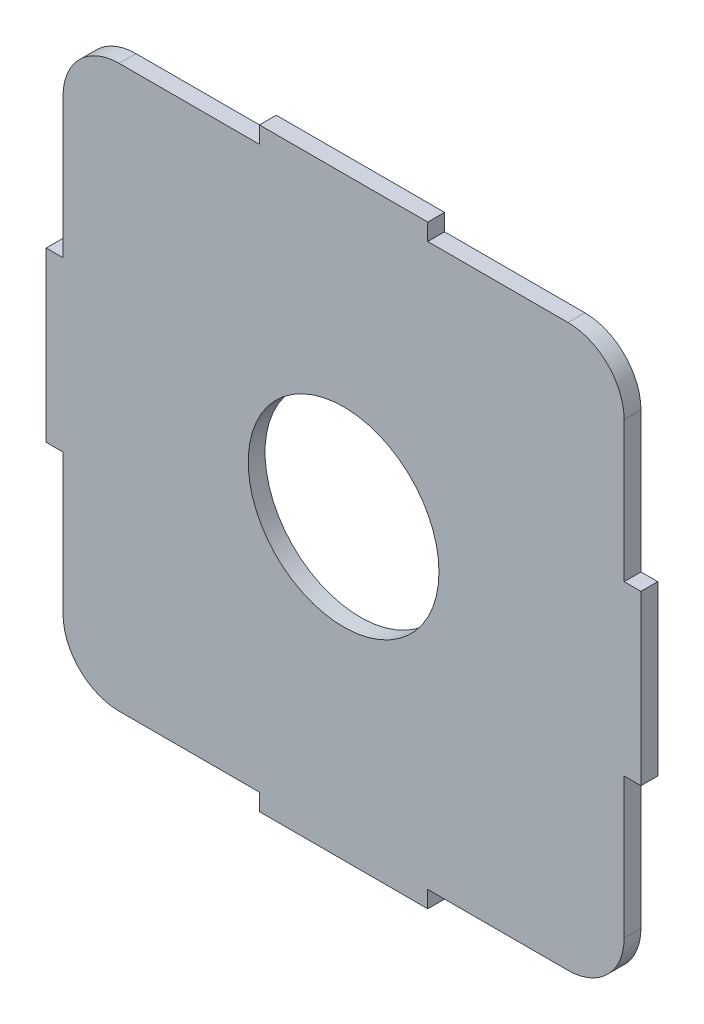
ISO-10303-21;
HEADER;
FILE_DESCRIPTION(('STEP AP214'),'2;1');
FILE_NAME('part.step','',(''),(''),'','','');
FILE_SCHEMA(('AUTOMOTIVE_DESIGN { 1 0 10303 214 1 1 1 1 }'));
ENDSEC;
DATA;
#1=APPLICATION_CONTEXT('core data for automotive mechanical design processes');
#2=APPLICATION_PROTOCOL_DEFINITION('international standard','automotive_design',2000,#1);
#3=PRODUCT_CONTEXT('',#1,'mechanical');
#4=PRODUCT('Part','Part','',(#3));
#5=PRODUCT_RELATED_PRODUCT_CATEGORY('part','',(#4));
#6=PRODUCT_DEFINITION_FORMATION('','',#4);
#7=PRODUCT_DEFINITION_CONTEXT('part definition',#1,'design');
#8=PRODUCT_DEFINITION('design','',#6,#7);
#9=PRODUCT_DEFINITION_SHAPE('','',#8);
#10=(LENGTH_UNIT() NAMED_UNIT(*) SI_UNIT(.MILLI.,.METRE.));
#11=(NAMED_UNIT(*) PLANE_ANGLE_UNIT() SI_UNIT($,.RADIAN.));
#12=(NAMED_UNIT(*) SI_UNIT($,.STERADIAN.) SOLID_ANGLE_UNIT());
#13=UNCERTAINTY_MEASURE_WITH_UNIT(LENGTH_MEASURE(1.E-05),#10,'distance_accuracy_value','');
#14=(GEOMETRIC_REPRESENTATION_CONTEXT(3) GLOBAL_UNCERTAINTY_ASSIGNED_CONTEXT((#13)) GLOBAL_UNIT_ASSIGNED_CONTEXT((#10,
#11,#12)) REPRESENTATION_CONTEXT('',''));
#15=CARTESIAN_POINT('',(0.,0.,0.));
#16=DIRECTION('',(0.,0.,1.));
#17=DIRECTION('',(1.,0.,0.));
#18=AXIS2_PLACEMENT_3D('',#15,#16,#17);
#19=CARTESIAN_POINT('',(35.,0.,3.));
#20=DIRECTION('',(0.,1.,0.));
#21=DIRECTION('',(-1.,0.,0.));
#22=AXIS2_PLACEMENT_3D('',#19,#20,#21);
#23=PLANE('',#22);
#24=DIRECTION('',(1.,0.,0.));
#25=VECTOR('',#24,1.);
#26=CARTESIAN_POINT('',(35.,0.,3.));
#27=LINE('',#26,#25);
#28=CARTESIAN_POINT('',(10.,0.,3.));
#29=VERTEX_POINT('',#28);
#30=CARTESIAN_POINT('',(35.,0.,3.));
#31=VERTEX_POINT('',#30);
#32=EDGE_CURVE('E192',#29,#31,#27,.T.);
#33=ORIENTED_EDGE('',*,*,#32,.F.);
#34=DIRECTION('',(0.,0.,-1.));
#35=VECTOR('',#34,1.);
#36=CARTESIAN_POINT('',(10.,0.,3.));
#37=LINE('',#36,#35);
#38=CARTESIAN_POINT('',(10.,0.,0.));
#39=VERTEX_POINT('',#38);
#40=EDGE_CURVE('E218',#29,#39,#37,.T.);
#41=ORIENTED_EDGE('',*,*,#40,.T.);
#42=DIRECTION('',(1.,0.,0.));
#43=VECTOR('',#42,1.);
#44=CARTESIAN_POINT('',(35.,0.,0.));
#45=LINE('',#44,#43);
#46=CARTESIAN_POINT('',(35.,0.,0.));
#47=VERTEX_POINT('',#46);
#48=EDGE_CURVE('E216',#39,#47,#45,.T.);
#49=ORIENTED_EDGE('',*,*,#48,.T.);
#50=DIRECTION('',(0.,0.,-1.));
#51=VECTOR('',#50,1.);
#52=CARTESIAN_POINT('',(35.,0.,3.));
#53=LINE('',#52,#51);
#54=EDGE_CURVE('E209',#31,#47,#53,.T.);
#55=ORIENTED_EDGE('',*,*,#54,.F.);
#56=EDGE_LOOP('',(#33,#41,#49,#55));
#57=FACE_BOUND('',#56,.T.);
#58=ADVANCED_FACE('F33',(#57),#23,.F.);
#59=CARTESIAN_POINT('',(35.,-3.00000000000001,3.));
#60=DIRECTION('',(1.,0.,0.));
#61=DIRECTION('',(0.,0.,-1.));
#62=AXIS2_PLACEMENT_3D('',#59,#60,#61);
#63=PLANE('',#62);
#64=DIRECTION('',(0.,-1.,0.));
#65=VECTOR('',#64,1.);
#66=CARTESIAN_POINT('',(35.,-3.00000000000001,0.));
#67=LINE('',#66,#65);
#68=CARTESIAN_POINT('',(35.,-3.00000000000001,0.));
#69=VERTEX_POINT('',#68);
#70=EDGE_CURVE('E335',#47,#69,#67,.T.);
#71=ORIENTED_EDGE('',*,*,#70,.T.);
#72=DIRECTION('',(0.,0.,-1.));
#73=VECTOR('',#72,1.);
#74=CARTESIAN_POINT('',(35.,-3.00000000000001,3.));
#75=LINE('',#74,#73);
#76=CARTESIAN_POINT('',(35.,-3.00000000000001,3.));
#77=VERTEX_POINT('',#76);
#78=EDGE_CURVE('E211',#77,#69,#75,.T.);
#79=ORIENTED_EDGE('',*,*,#78,.F.);
#80=DIRECTION('',(0.,-1.,0.));
#81=VECTOR('',#80,1.);
#82=CARTESIAN_POINT('',(35.,-3.00000000000001,3.));
#83=LINE('',#82,#81);
#84=EDGE_CURVE('E196',#31,#77,#83,.T.);
#85=ORIENTED_EDGE('',*,*,#84,.F.);
#86=ORIENTED_EDGE('',*,*,#54,.T.);
#87=EDGE_LOOP('',(#71,#79,#85,#86));
#88=FACE_BOUND('',#87,.T.);
#89=ADVANCED_FACE('F208',(#88),#63,.F.);
#90=CARTESIAN_POINT('',(65.,-3.00000000000001,3.));
#91=DIRECTION('',(0.,1.,0.));
#92=DIRECTION('',(-1.,0.,0.));
#93=AXIS2_PLACEMENT_3D('',#90,#91,#92);
#94=PLANE('',#93);
#95=DIRECTION('',(1.,0.,0.));
#96=VECTOR('',#95,1.);
#97=CARTESIAN_POINT('',(65.,-3.00000000000001,0.));
#98=LINE('',#97,#96);
#99=CARTESIAN_POINT('',(65.,-3.00000000000001,0.));
#100=VERTEX_POINT('',#99);
#101=EDGE_CURVE('E329',#69,#100,#98,.T.);
#102=ORIENTED_EDGE('',*,*,#101,.T.);
#103=DIRECTION('',(0.,0.,-1.));
#104=VECTOR('',#103,1.);
#105=CARTESIAN_POINT('',(65.,-3.00000000000001,3.));
#106=LINE('',#105,#104);
#107=CARTESIAN_POINT('',(65.,-3.00000000000001,3.));
#108=VERTEX_POINT('',#107);
#109=EDGE_CURVE('E222',#108,#100,#106,.T.);
#110=ORIENTED_EDGE('',*,*,#109,.F.);
#111=DIRECTION('',(1.,0.,0.));
#112=VECTOR('',#111,1.);
#113=CARTESIAN_POINT('',(65.,-3.00000000000001,3.));
#114=LINE('',#113,#112);
#115=EDGE_CURVE('E213',#77,#108,#114,.T.);
#116=ORIENTED_EDGE('',*,*,#115,.F.);
#117=ORIENTED_EDGE('',*,*,#78,.T.);
#118=EDGE_LOOP('',(#102,#110,#116,#117));
#119=FACE_BOUND('',#118,.T.);
#120=ADVANCED_FACE('F378',(#119),#94,.F.);
#121=CARTESIAN_POINT('',(65.,-3.00000000000001,3.));
#122=DIRECTION('',(-1.,0.,0.));
#123=DIRECTION('',(0.,0.,1.));
#124=AXIS2_PLACEMENT_3D('',#121,#122,#123);
#125=PLANE('',#124);
#126=DIRECTION('',(0.,1.,0.));
#127=VECTOR('',#126,1.);
#128=CARTESIAN_POINT('',(65.,-3.00000000000001,0.));
#129=LINE('',#128,#127);
#130=CARTESIAN_POINT('',(65.,0.,0.));
#131=VERTEX_POINT('',#130);
#132=EDGE_CURVE('E324',#100,#131,#129,.T.);
#133=ORIENTED_EDGE('',*,*,#132,.T.);
#134=DIRECTION('',(0.,0.,-1.));
#135=VECTOR('',#134,1.);
#136=CARTESIAN_POINT('',(65.,0.,3.));
#137=LINE('',#136,#135);
#138=CARTESIAN_POINT('',(65.,0.,3.));
#139=VERTEX_POINT('',#138);
#140=EDGE_CURVE('E315',#139,#131,#137,.T.);
#141=ORIENTED_EDGE('',*,*,#140,.F.);
#142=DIRECTION('',(0.,1.,0.));
#143=VECTOR('',#142,1.);
#144=CARTESIAN_POINT('',(65.,-3.00000000000001,3.));
#145=LINE('',#144,#143);
#146=EDGE_CURVE('E325',#108,#139,#145,.T.);
#147=ORIENTED_EDGE('',*,*,#146,.F.);
#148=ORIENTED_EDGE('',*,*,#109,.T.);
#149=EDGE_LOOP('',(#133,#141,#147,#148));
#150=FACE_BOUND('',#149,.T.);
#151=ADVANCED_FACE('F322',(#150),#125,.F.);
#152=CARTESIAN_POINT('',(100.,0.,3.));
#153=DIRECTION('',(0.,1.,0.));
#154=DIRECTION('',(-1.,0.,0.));
#155=AXIS2_PLACEMENT_3D('',#152,#153,#154);
#156=PLANE('',#155);
#157=DIRECTION('',(1.,0.,0.));
#158=VECTOR('',#157,1.);
#159=CARTESIAN_POINT('',(100.,0.,0.));
#160=LINE('',#159,#158);
#161=CARTESIAN_POINT('',(90.0000000000001,0.,0.));
#162=VERTEX_POINT('',#161);
#163=EDGE_CURVE('E331',#131,#162,#160,.T.);
#164=ORIENTED_EDGE('',*,*,#163,.T.);
#165=DIRECTION('',(0.,0.,-1.));
#166=VECTOR('',#165,1.);
#167=CARTESIAN_POINT('',(90.0000000000001,0.,3.));
#168=LINE('',#167,#166);
#169=CARTESIAN_POINT('',(90.0000000000001,0.,3.));
#170=VERTEX_POINT('',#169);
#171=EDGE_CURVE('E244',#162,#170,#168,.F.);
#172=ORIENTED_EDGE('',*,*,#171,.T.);
#173=DIRECTION('',(1.,0.,0.));
#174=VECTOR('',#173,1.);
#175=CARTESIAN_POINT('',(100.,0.,3.));
#176=LINE('',#175,#174);
#177=EDGE_CURVE('E380',#139,#170,#176,.T.);
#178=ORIENTED_EDGE('',*,*,#177,.F.);
#179=ORIENTED_EDGE('',*,*,#140,.T.);
#180=EDGE_LOOP('',(#164,#172,#178,#179));
#181=FACE_BOUND('',#180,.T.);
#182=ADVANCED_FACE('F445',(#181),#156,.F.);
#183=CARTESIAN_POINT('',(100.,35.,3.));
#184=DIRECTION('',(-1.,0.,0.));
#185=DIRECTION('',(0.,-1.,0.));
#186=AXIS2_PLACEMENT_3D('',#183,#184,#185);
#187=PLANE('',#186);
#188=DIRECTION('',(0.,1.,0.));
#189=VECTOR('',#188,1.);
#190=CARTESIAN_POINT('',(100.,35.,3.));
#191=LINE('',#190,#189);
#192=CARTESIAN_POINT('',(100.,10.,3.));
#193=VERTEX_POINT('',#192);
#194=CARTESIAN_POINT('',(100.,35.,3.));
#195=VERTEX_POINT('',#194);
#196=EDGE_CURVE('E385',#193,#195,#191,.T.);
#197=ORIENTED_EDGE('',*,*,#196,.F.);
#198=DIRECTION('',(0.,0.,-1.));
#199=VECTOR('',#198,1.);
#200=CARTESIAN_POINT('',(100.,10.,3.));
#201=LINE('',#200,#199);
#202=CARTESIAN_POINT('',(100.,10.,0.));
#203=VERTEX_POINT('',#202);
#204=EDGE_CURVE('E241',#193,#203,#201,.T.);
#205=ORIENTED_EDGE('',*,*,#204,.T.);
#206=DIRECTION('',(0.,1.,0.));
#207=VECTOR('',#206,1.);
#208=CARTESIAN_POINT('',(100.,35.,0.));
#209=LINE('',#208,#207);
#210=CARTESIAN_POINT('',(100.,35.,0.));
#211=VERTEX_POINT('',#210);
#212=EDGE_CURVE('E333',#203,#211,#209,.T.);
#213=ORIENTED_EDGE('',*,*,#212,.T.);
#214=DIRECTION('',(0.,0.,-1.));
#215=VECTOR('',#214,1.);
#216=CARTESIAN_POINT('',(100.,35.,3.));
#217=LINE('',#216,#215);
#218=EDGE_CURVE('E312',#195,#211,#217,.T.);
#219=ORIENTED_EDGE('',*,*,#218,.F.);
#220=EDGE_LOOP('',(#197,#205,#213,#219));
#221=FACE_BOUND('',#220,.T.);
#222=ADVANCED_FACE('F440',(#221),#187,.F.);
#223=CARTESIAN_POINT('',(103.,35.,3.));
#224=DIRECTION('',(0.,1.,0.));
#225=DIRECTION('',(0.,0.,1.));
#226=AXIS2_PLACEMENT_3D('',#223,#224,#225);
#227=PLANE('',#226);
#228=DIRECTION('',(1.,0.,0.));
#229=VECTOR('',#228,1.);
#230=CARTESIAN_POINT('',(103.,35.,0.));
#231=LINE('',#230,#229);
#232=CARTESIAN_POINT('',(103.,35.,0.));
#233=VERTEX_POINT('',#232);
#234=EDGE_CURVE('E340',#211,#233,#231,.T.);
#235=ORIENTED_EDGE('',*,*,#234,.T.);
#236=DIRECTION('',(0.,0.,-1.));
#237=VECTOR('',#236,1.);
#238=CARTESIAN_POINT('',(103.,35.,3.));
#239=LINE('',#238,#237);
#240=CARTESIAN_POINT('',(103.,35.,3.));
#241=VERTEX_POINT('',#240);
#242=EDGE_CURVE('E309',#241,#233,#239,.T.);
#243=ORIENTED_EDGE('',*,*,#242,.F.);
#244=DIRECTION('',(1.,0.,0.));
#245=VECTOR('',#244,1.);
#246=CARTESIAN_POINT('',(103.,35.,3.));
#247=LINE('',#246,#245);
#248=EDGE_CURVE('E387',#195,#241,#247,.T.);
#249=ORIENTED_EDGE('',*,*,#248,.F.);
#250=ORIENTED_EDGE('',*,*,#218,.T.);
#251=EDGE_LOOP('',(#235,#243,#249,#250));
#252=FACE_BOUND('',#251,.T.);
#253=ADVANCED_FACE('F436',(#252),#227,.F.);
#254=CARTESIAN_POINT('',(103.,65.,3.));
#255=DIRECTION('',(-1.,0.,0.));
#256=DIRECTION('',(0.,0.,1.));
#257=AXIS2_PLACEMENT_3D('',#254,#255,#256);
#258=PLANE('',#257);
#259=DIRECTION('',(0.,1.,0.));
#260=VECTOR('',#259,1.);
#261=CARTESIAN_POINT('',(103.,65.,0.));
#262=LINE('',#261,#260);
#263=CARTESIAN_POINT('',(103.,65.,0.));
#264=VERTEX_POINT('',#263);
#265=EDGE_CURVE('E342',#233,#264,#262,.T.);
#266=ORIENTED_EDGE('',*,*,#265,.T.);
#267=DIRECTION('',(0.,0.,-1.));
#268=VECTOR('',#267,1.);
#269=CARTESIAN_POINT('',(103.,65.,3.));
#270=LINE('',#269,#268);
#271=CARTESIAN_POINT('',(103.,65.,3.));
#272=VERTEX_POINT('',#271);
#273=EDGE_CURVE('E306',#272,#264,#270,.T.);
#274=ORIENTED_EDGE('',*,*,#273,.F.);
#275=DIRECTION('',(0.,1.,0.));
#276=VECTOR('',#275,1.);
#277=CARTESIAN_POINT('',(103.,65.,3.));
#278=LINE('',#277,#276);
#279=EDGE_CURVE('E389',#241,#272,#278,.T.);
#280=ORIENTED_EDGE('',*,*,#279,.F.);
#281=ORIENTED_EDGE('',*,*,#242,.T.);
#282=EDGE_LOOP('',(#266,#274,#280,#281));
#283=FACE_BOUND('',#282,.T.);
#284=ADVANCED_FACE('F431',(#283),#258,.F.);
#285=CARTESIAN_POINT('',(103.,65.,3.));
#286=DIRECTION('',(0.,-1.,0.));
#287=DIRECTION('',(0.,0.,-1.));
#288=AXIS2_PLACEMENT_3D('',#285,#286,#287);
#289=PLANE('',#288);
#290=DIRECTION('',(-1.,0.,0.));
#291=VECTOR('',#290,1.);
#292=CARTESIAN_POINT('',(103.,65.,0.));
#293=LINE('',#292,#291);
#294=CARTESIAN_POINT('',(100.,65.,0.));
#295=VERTEX_POINT('',#294);
#296=EDGE_CURVE('E344',#264,#295,#293,.T.);
#297=ORIENTED_EDGE('',*,*,#296,.T.);
#298=DIRECTION('',(0.,0.,-1.));
#299=VECTOR('',#298,1.);
#300=CARTESIAN_POINT('',(100.,65.,3.));
#301=LINE('',#300,#299);
#302=CARTESIAN_POINT('',(100.,65.,3.));
#303=VERTEX_POINT('',#302);
#304=EDGE_CURVE('E303',#303,#295,#301,.T.);
#305=ORIENTED_EDGE('',*,*,#304,.F.);
#306=DIRECTION('',(-1.,0.,0.));
#307=VECTOR('',#306,1.);
#308=CARTESIAN_POINT('',(103.,65.,3.));
#309=LINE('',#308,#307);
#310=EDGE_CURVE('E391',#272,#303,#309,.T.);
#311=ORIENTED_EDGE('',*,*,#310,.F.);
#312=ORIENTED_EDGE('',*,*,#273,.T.);
#313=EDGE_LOOP('',(#297,#305,#311,#312));
#314=FACE_BOUND('',#313,.T.);
#315=ADVANCED_FACE('F425',(#314),#289,.F.);
#316=CARTESIAN_POINT('',(100.,100.,3.));
#317=DIRECTION('',(-1.,0.,0.));
#318=DIRECTION('',(0.,-1.,0.));
#319=AXIS2_PLACEMENT_3D('',#316,#317,#318);
#320=PLANE('',#319);
#321=DIRECTION('',(0.,1.,0.));
#322=VECTOR('',#321,1.);
#323=CARTESIAN_POINT('',(100.,100.,0.));
#324=LINE('',#323,#322);
#325=CARTESIAN_POINT('',(100.,90.,0.));
#326=VERTEX_POINT('',#325);
#327=EDGE_CURVE('E346',#295,#326,#324,.T.);
#328=ORIENTED_EDGE('',*,*,#327,.T.);
#329=DIRECTION('',(0.,0.,-1.));
#330=VECTOR('',#329,1.);
#331=CARTESIAN_POINT('',(100.,90.,3.));
#332=LINE('',#331,#330);
#333=CARTESIAN_POINT('',(100.,90.,3.));
#334=VERTEX_POINT('',#333);
#335=EDGE_CURVE('E249',#326,#334,#332,.F.);
#336=ORIENTED_EDGE('',*,*,#335,.T.);
#337=DIRECTION('',(0.,1.,0.));
#338=VECTOR('',#337,1.);
#339=CARTESIAN_POINT('',(100.,100.,3.));
#340=LINE('',#339,#338);
#341=EDGE_CURVE('E393',#303,#334,#340,.T.);
#342=ORIENTED_EDGE('',*,*,#341,.F.);
#343=ORIENTED_EDGE('',*,*,#304,.T.);
#344=EDGE_LOOP('',(#328,#336,#342,#343));
#345=FACE_BOUND('',#344,.T.);
#346=ADVANCED_FACE('F420',(#345),#320,.F.);
#347=CARTESIAN_POINT('',(65.,100.,3.));
#348=DIRECTION('',(0.,-1.,0.));
#349=DIRECTION('',(0.,0.,-1.));
#350=AXIS2_PLACEMENT_3D('',#347,#348,#349);
#351=PLANE('',#350);
#352=DIRECTION('',(-1.,0.,0.));
#353=VECTOR('',#352,1.);
#354=CARTESIAN_POINT('',(65.,100.,3.));
#355=LINE('',#354,#353);
#356=CARTESIAN_POINT('',(90.,100.,3.));
#357=VERTEX_POINT('',#356);
#358=CARTESIAN_POINT('',(65.,100.,3.));
#359=VERTEX_POINT('',#358);
#360=EDGE_CURVE('E396',#357,#359,#355,.T.);
#361=ORIENTED_EDGE('',*,*,#360,.F.);
#362=DIRECTION('',(0.,0.,-1.));
#363=VECTOR('',#362,1.);
#364=CARTESIAN_POINT('',(90.,100.,3.));
#365=LINE('',#364,#363);
#366=CARTESIAN_POINT('',(90.,100.,0.));
#367=VERTEX_POINT('',#366);
#368=EDGE_CURVE('E246',#357,#367,#365,.T.);
#369=ORIENTED_EDGE('',*,*,#368,.T.);
#370=DIRECTION('',(-1.,0.,0.));
#371=VECTOR('',#370,1.);
#372=CARTESIAN_POINT('',(65.,100.,0.));
#373=LINE('',#372,#371);
#374=CARTESIAN_POINT('',(65.,100.,0.));
#375=VERTEX_POINT('',#374);
#376=EDGE_CURVE('E349',#367,#375,#373,.T.);
#377=ORIENTED_EDGE('',*,*,#376,.T.);
#378=DIRECTION('',(0.,0.,-1.));
#379=VECTOR('',#378,1.);
#380=CARTESIAN_POINT('',(65.,100.,3.));
#381=LINE('',#380,#379);
#382=EDGE_CURVE('E300',#359,#375,#381,.T.);
#383=ORIENTED_EDGE('',*,*,#382,.F.);
#384=EDGE_LOOP('',(#361,#369,#377,#383));
#385=FACE_BOUND('',#384,.T.);
#386=ADVANCED_FACE('F411',(#385),#351,.F.);
#387=CARTESIAN_POINT('',(65.,103.,3.));
#388=DIRECTION('',(-1.,0.,0.));
#389=DIRECTION('',(0.,0.,1.));
#390=AXIS2_PLACEMENT_3D('',#387,#388,#389);
#391=PLANE('',#390);
#392=DIRECTION('',(0.,1.,0.));
#393=VECTOR('',#392,1.);
#394=CARTESIAN_POINT('',(65.,103.,0.));
#395=LINE('',#394,#393);
#396=CARTESIAN_POINT('',(65.,103.,0.));
#397=VERTEX_POINT('',#396);
#398=EDGE_CURVE('E351',#375,#397,#395,.T.);
#399=ORIENTED_EDGE('',*,*,#398,.T.);
#400=DIRECTION('',(0.,0.,-1.));
#401=VECTOR('',#400,1.);
#402=CARTESIAN_POINT('',(65.,103.,3.));
#403=LINE('',#402,#401);
#404=CARTESIAN_POINT('',(65.,103.,3.));
#405=VERTEX_POINT('',#404);
#406=EDGE_CURVE('E297',#405,#397,#403,.T.);
#407=ORIENTED_EDGE('',*,*,#406,.F.);
#408=DIRECTION('',(0.,1.,0.));
#409=VECTOR('',#408,1.);
#410=CARTESIAN_POINT('',(65.,103.,3.));
#411=LINE('',#410,#409);
#412=EDGE_CURVE('E398',#359,#405,#411,.T.);
#413=ORIENTED_EDGE('',*,*,#412,.F.);
#414=ORIENTED_EDGE('',*,*,#382,.T.);
#415=EDGE_LOOP('',(#399,#407,#413,#414));
#416=FACE_BOUND('',#415,.T.);
#417=ADVANCED_FACE('F407',(#416),#391,.F.);
#418=CARTESIAN_POINT('',(35.,103.,3.));
#419=DIRECTION('',(0.,-1.,0.));
#420=DIRECTION('',(0.,0.,-1.));
#421=AXIS2_PLACEMENT_3D('',#418,#419,#420);
#422=PLANE('',#421);
#423=DIRECTION('',(-1.,0.,0.));
#424=VECTOR('',#423,1.);
#425=CARTESIAN_POINT('',(35.,103.,0.));
#426=LINE('',#425,#424);
#427=CARTESIAN_POINT('',(35.,103.,0.));
#428=VERTEX_POINT('',#427);
#429=EDGE_CURVE('E353',#397,#428,#426,.T.);
#430=ORIENTED_EDGE('',*,*,#429,.T.);
#431=DIRECTION('',(0.,0.,-1.));
#432=VECTOR('',#431,1.);
#433=CARTESIAN_POINT('',(35.,103.,3.));
#434=LINE('',#433,#432);
#435=CARTESIAN_POINT('',(35.,103.,3.));
#436=VERTEX_POINT('',#435);
#437=EDGE_CURVE('E294',#436,#428,#434,.T.);
#438=ORIENTED_EDGE('',*,*,#437,.F.);
#439=DIRECTION('',(-1.,0.,0.));
#440=VECTOR('',#439,1.);
#441=CARTESIAN_POINT('',(35.,103.,3.));
#442=LINE('',#441,#440);
#443=EDGE_CURVE('E367',#405,#436,#442,.T.);
#444=ORIENTED_EDGE('',*,*,#443,.F.);
#445=ORIENTED_EDGE('',*,*,#406,.T.);
#446=EDGE_LOOP('',(#430,#438,#444,#445));
#447=FACE_BOUND('',#446,.T.);
#448=ADVANCED_FACE('F403',(#447),#422,.F.);
#449=CARTESIAN_POINT('',(35.,103.,3.));
#450=DIRECTION('',(1.,0.,0.));
#451=DIRECTION('',(0.,0.,-1.));
#452=AXIS2_PLACEMENT_3D('',#449,#450,#451);
#453=PLANE('',#452);
#454=DIRECTION('',(0.,-1.,0.));
#455=VECTOR('',#454,1.);
#456=CARTESIAN_POINT('',(35.,103.,0.));
#457=LINE('',#456,#455);
#458=CARTESIAN_POINT('',(35.,100.,0.));
#459=VERTEX_POINT('',#458);
#460=EDGE_CURVE('E270',#428,#459,#457,.T.);
#461=ORIENTED_EDGE('',*,*,#460,.T.);
#462=DIRECTION('',(0.,0.,-1.));
#463=VECTOR('',#462,1.);
#464=CARTESIAN_POINT('',(35.,100.,3.));
#465=LINE('',#464,#463);
#466=CARTESIAN_POINT('',(35.,100.,3.));
#467=VERTEX_POINT('',#466);
#468=EDGE_CURVE('E291',#467,#459,#465,.T.);
#469=ORIENTED_EDGE('',*,*,#468,.F.);
#470=DIRECTION('',(0.,-1.,0.));
#471=VECTOR('',#470,1.);
#472=CARTESIAN_POINT('',(35.,103.,3.));
#473=LINE('',#472,#471);
#474=EDGE_CURVE('E363',#436,#467,#473,.T.);
#475=ORIENTED_EDGE('',*,*,#474,.F.);
#476=ORIENTED_EDGE('',*,*,#437,.T.);
#477=EDGE_LOOP('',(#461,#469,#475,#476));
#478=FACE_BOUND('',#477,.T.);
#479=ADVANCED_FACE('F357',(#478),#453,.F.);
#480=CARTESIAN_POINT('',(0.,100.,3.));
#481=DIRECTION('',(0.,-1.,0.));
#482=DIRECTION('',(0.,0.,-1.));
#483=AXIS2_PLACEMENT_3D('',#480,#481,#482);
#484=PLANE('',#483);
#485=DIRECTION('',(-1.,0.,0.));
#486=VECTOR('',#485,1.);
#487=CARTESIAN_POINT('',(0.,100.,0.));
#488=LINE('',#487,#486);
#489=CARTESIAN_POINT('',(10.,100.,0.));
#490=VERTEX_POINT('',#489);
#491=EDGE_CURVE('E266',#459,#490,#488,.T.);
#492=ORIENTED_EDGE('',*,*,#491,.T.);
#493=DIRECTION('',(0.,0.,-1.));
#494=VECTOR('',#493,1.);
#495=CARTESIAN_POINT('',(10.,100.,3.));
#496=LINE('',#495,#494);
#497=CARTESIAN_POINT('',(10.,100.,3.));
#498=VERTEX_POINT('',#497);
#499=EDGE_CURVE('E11',#490,#498,#496,.F.);
#500=ORIENTED_EDGE('',*,*,#499,.T.);
#501=DIRECTION('',(-1.,0.,0.));
#502=VECTOR('',#501,1.);
#503=CARTESIAN_POINT('',(0.,100.,3.));
#504=LINE('',#503,#502);
#505=EDGE_CURVE('E362',#467,#498,#504,.T.);
#506=ORIENTED_EDGE('',*,*,#505,.F.);
#507=ORIENTED_EDGE('',*,*,#468,.T.);
#508=EDGE_LOOP('',(#492,#500,#506,#507));
#509=FACE_BOUND('',#508,.T.);
#510=ADVANCED_FACE('F361',(#509),#484,.F.);
#511=CARTESIAN_POINT('',(0.,65.,3.));
#512=DIRECTION('',(1.,0.,0.));
#513=DIRECTION('',(0.,0.,-1.));
#514=AXIS2_PLACEMENT_3D('',#511,#512,#513);
#515=PLANE('',#514);
#516=DIRECTION('',(0.,-1.,0.));
#517=VECTOR('',#516,1.);
#518=CARTESIAN_POINT('',(0.,65.,3.));
#519=LINE('',#518,#517);
#520=CARTESIAN_POINT('',(0.,90.,3.));
#521=VERTEX_POINT('',#520);
#522=CARTESIAN_POINT('',(0.,65.,3.));
#523=VERTEX_POINT('',#522);
#524=EDGE_CURVE('E258',#521,#523,#519,.T.);
#525=ORIENTED_EDGE('',*,*,#524,.F.);
#526=DIRECTION('',(0.,0.,-1.));
#527=VECTOR('',#526,1.);
#528=CARTESIAN_POINT('',(0.,90.,3.));
#529=LINE('',#528,#527);
#530=CARTESIAN_POINT('',(0.,90.,0.));
#531=VERTEX_POINT('',#530);
#532=EDGE_CURVE('E41',#521,#531,#529,.T.);
#533=ORIENTED_EDGE('',*,*,#532,.T.);
#534=DIRECTION('',(0.,-1.,0.));
#535=VECTOR('',#534,1.);
#536=CARTESIAN_POINT('',(0.,65.,0.));
#537=LINE('',#536,#535);
#538=CARTESIAN_POINT('',(0.,65.,0.));
#539=VERTEX_POINT('',#538);
#540=EDGE_CURVE('E256',#531,#539,#537,.T.);
#541=ORIENTED_EDGE('',*,*,#540,.T.);
#542=DIRECTION('',(0.,0.,-1.));
#543=VECTOR('',#542,1.);
#544=CARTESIAN_POINT('',(0.,65.,3.));
#545=LINE('',#544,#543);
#546=EDGE_CURVE('E289',#523,#539,#545,.T.);
#547=ORIENTED_EDGE('',*,*,#546,.F.);
#548=EDGE_LOOP('',(#525,#533,#541,#547));
#549=FACE_BOUND('',#548,.T.);
#550=ADVANCED_FACE('F254',(#549),#515,.F.);
#551=CARTESIAN_POINT('',(-3.,65.,3.));
#552=DIRECTION('',(0.,-1.,0.));
#553=DIRECTION('',(0.,0.,-1.));
#554=AXIS2_PLACEMENT_3D('',#551,#552,#553);
#555=PLANE('',#554);
#556=DIRECTION('',(-1.,0.,0.));
#557=VECTOR('',#556,1.);
#558=CARTESIAN_POINT('',(-3.,65.,0.));
#559=LINE('',#558,#557);
#560=CARTESIAN_POINT('',(-3.,65.,0.));
#561=VERTEX_POINT('',#560);
#562=EDGE_CURVE('E265',#539,#561,#559,.T.);
#563=ORIENTED_EDGE('',*,*,#562,.T.);
#564=DIRECTION('',(0.,0.,-1.));
#565=VECTOR('',#564,1.);
#566=CARTESIAN_POINT('',(-3.,65.,3.));
#567=LINE('',#566,#565);
#568=CARTESIAN_POINT('',(-3.,65.,3.));
#569=VERTEX_POINT('',#568);
#570=EDGE_CURVE('E286',#569,#561,#567,.T.);
#571=ORIENTED_EDGE('',*,*,#570,.F.);
#572=DIRECTION('',(-1.,0.,0.));
#573=VECTOR('',#572,1.);
#574=CARTESIAN_POINT('',(-3.,65.,3.));
#575=LINE('',#574,#573);
#576=EDGE_CURVE('E365',#523,#569,#575,.T.);
#577=ORIENTED_EDGE('',*,*,#576,.F.);
#578=ORIENTED_EDGE('',*,*,#546,.T.);
#579=EDGE_LOOP('',(#563,#571,#577,#578));
#580=FACE_BOUND('',#579,.T.);
#581=ADVANCED_FACE('F494',(#580),#555,.F.);
#582=CARTESIAN_POINT('',(-3.,35.,3.));
#583=DIRECTION('',(1.,0.,0.));
#584=DIRECTION('',(0.,0.,-1.));
#585=AXIS2_PLACEMENT_3D('',#582,#583,#584);
#586=PLANE('',#585);
#587=DIRECTION('',(0.,-1.,0.));
#588=VECTOR('',#587,1.);
#589=CARTESIAN_POINT('',(-3.,35.,0.));
#590=LINE('',#589,#588);
#591=CARTESIAN_POINT('',(-3.,35.,0.));
#592=VERTEX_POINT('',#591);
#593=EDGE_CURVE('E268',#561,#592,#590,.T.);
#594=ORIENTED_EDGE('',*,*,#593,.T.);
#595=DIRECTION('',(0.,0.,-1.));
#596=VECTOR('',#595,1.);
#597=CARTESIAN_POINT('',(-3.,35.,3.));
#598=LINE('',#597,#596);
#599=CARTESIAN_POINT('',(-3.,35.,3.));
#600=VERTEX_POINT('',#599);
#601=EDGE_CURVE('E282',#600,#592,#598,.T.);
#602=ORIENTED_EDGE('',*,*,#601,.F.);
#603=DIRECTION('',(0.,-1.,0.));
#604=VECTOR('',#603,1.);
#605=CARTESIAN_POINT('',(-3.,35.,3.));
#606=LINE('',#605,#604);
#607=EDGE_CURVE('E372',#569,#600,#606,.T.);
#608=ORIENTED_EDGE('',*,*,#607,.F.);
#609=ORIENTED_EDGE('',*,*,#570,.T.);
#610=EDGE_LOOP('',(#594,#602,#608,#609));
#611=FACE_BOUND('',#610,.T.);
#612=ADVANCED_FACE('F497',(#611),#586,.F.);
#613=CARTESIAN_POINT('',(-3.,35.,3.));
#614=DIRECTION('',(0.,1.,0.));
#615=DIRECTION('',(0.,0.,1.));
#616=AXIS2_PLACEMENT_3D('',#613,#614,#615);
#617=PLANE('',#616);
#618=DIRECTION('',(1.,0.,0.));
#619=VECTOR('',#618,1.);
#620=CARTESIAN_POINT('',(-3.,35.,0.));
#621=LINE('',#620,#619);
#622=CARTESIAN_POINT('',(0.,35.,0.));
#623=VERTEX_POINT('',#622);
#624=EDGE_CURVE('E275',#592,#623,#621,.T.);
#625=ORIENTED_EDGE('',*,*,#624,.T.);
#626=DIRECTION('',(0.,0.,-1.));
#627=VECTOR('',#626,1.);
#628=CARTESIAN_POINT('',(0.,35.,3.));
#629=LINE('',#628,#627);
#630=CARTESIAN_POINT('',(0.,35.,3.));
#631=VERTEX_POINT('',#630);
#632=EDGE_CURVE('E279',#631,#623,#629,.T.);
#633=ORIENTED_EDGE('',*,*,#632,.F.);
#634=DIRECTION('',(1.,0.,0.));
#635=VECTOR('',#634,1.);
#636=CARTESIAN_POINT('',(-3.,35.,3.));
#637=LINE('',#636,#635);
#638=EDGE_CURVE('E374',#600,#631,#637,.T.);
#639=ORIENTED_EDGE('',*,*,#638,.F.);
#640=ORIENTED_EDGE('',*,*,#601,.T.);
#641=EDGE_LOOP('',(#625,#633,#639,#640));
#642=FACE_BOUND('',#641,.T.);
#643=ADVANCED_FACE('F501',(#642),#617,.F.);
#644=CARTESIAN_POINT('',(0.,0.,3.));
#645=DIRECTION('',(1.,0.,0.));
#646=DIRECTION('',(0.,0.,-1.));
#647=AXIS2_PLACEMENT_3D('',#644,#645,#646);
#648=PLANE('',#647);
#649=DIRECTION('',(0.,-1.,0.));
#650=VECTOR('',#649,1.);
#651=CARTESIAN_POINT('',(0.,0.,0.));
#652=LINE('',#651,#650);
#653=CARTESIAN_POINT('',(0.,10.,0.));
#654=VERTEX_POINT('',#653);
#655=EDGE_CURVE('E204',#623,#654,#652,.T.);
#656=ORIENTED_EDGE('',*,*,#655,.T.);
#657=DIRECTION('',(0.,0.,-1.));
#658=VECTOR('',#657,1.);
#659=CARTESIAN_POINT('',(0.,10.,3.));
#660=LINE('',#659,#658);
#661=CARTESIAN_POINT('',(0.,10.,3.));
#662=VERTEX_POINT('',#661);
#663=EDGE_CURVE('E233',#654,#662,#660,.F.);
#664=ORIENTED_EDGE('',*,*,#663,.T.);
#665=DIRECTION('',(0.,-1.,0.));
#666=VECTOR('',#665,1.);
#667=CARTESIAN_POINT('',(0.,0.,3.));
#668=LINE('',#667,#666);
#669=EDGE_CURVE('E283',#631,#662,#668,.T.);
#670=ORIENTED_EDGE('',*,*,#669,.F.);
#671=ORIENTED_EDGE('',*,*,#632,.T.);
#672=EDGE_LOOP('',(#656,#664,#670,#671));
#673=FACE_BOUND('',#672,.T.);
#674=ADVANCED_FACE('F505',(#673),#648,.F.);
#675=CARTESIAN_POINT('',(0.,0.,3.));
#676=DIRECTION('',(0.,0.,-1.));
#677=DIRECTION('',(-1.,0.,0.));
#678=AXIS2_PLACEMENT_3D('',#675,#676,#677);
#679=PLANE('',#678);
#680=CARTESIAN_POINT('',(50.,50.,3.));
#681=DIRECTION('',(0.,0.,1.));
#682=DIRECTION('',(1.,0.,0.));
#683=AXIS2_PLACEMENT_3D('',#680,#681,#682);
#684=CIRCLE('',#683,17.);
#685=CARTESIAN_POINT('',(67.,50.,3.));
#686=VERTEX_POINT('',#685);
#687=EDGE_CURVE('E523',#686,#686,#684,.T.);
#688=ORIENTED_EDGE('',*,*,#687,.F.);
#689=EDGE_LOOP('',(#688));
#690=FACE_BOUND('',#689,.T.);
#691=ORIENTED_EDGE('',*,*,#669,.T.);
#692=CARTESIAN_POINT('',(10.,10.,3.));
#693=DIRECTION('',(0.,0.,-1.));
#694=DIRECTION('',(-1.,0.,0.));
#695=AXIS2_PLACEMENT_3D('',#692,#693,#694);
#696=CIRCLE('',#695,10.);
#697=EDGE_CURVE('E199',#662,#29,#696,.F.);
#698=ORIENTED_EDGE('',*,*,#697,.T.);
#699=ORIENTED_EDGE('',*,*,#32,.T.);
#700=ORIENTED_EDGE('',*,*,#84,.T.);
#701=ORIENTED_EDGE('',*,*,#115,.T.);
#702=ORIENTED_EDGE('',*,*,#146,.T.);
#703=ORIENTED_EDGE('',*,*,#177,.T.);
#704=CARTESIAN_POINT('',(90.0000000000001,9.99999999999999,3.));
#705=DIRECTION('',(0.,0.,-1.));
#706=DIRECTION('',(-1.,0.,0.));
#707=AXIS2_PLACEMENT_3D('',#704,#705,#706);
#708=CIRCLE('',#707,10.);
#709=EDGE_CURVE('E238',#170,#193,#708,.F.);
#710=ORIENTED_EDGE('',*,*,#709,.T.);
#711=ORIENTED_EDGE('',*,*,#196,.T.);
#712=ORIENTED_EDGE('',*,*,#248,.T.);
#713=ORIENTED_EDGE('',*,*,#279,.T.);
#714=ORIENTED_EDGE('',*,*,#310,.T.);
#715=ORIENTED_EDGE('',*,*,#341,.T.);
#716=CARTESIAN_POINT('',(90.,90.,3.));
#717=DIRECTION('',(0.,0.,-1.));
#718=DIRECTION('',(-1.,0.,0.));
#719=AXIS2_PLACEMENT_3D('',#716,#717,#718);
#720=CIRCLE('',#719,10.);
#721=EDGE_CURVE('E236',#334,#357,#720,.F.);
#722=ORIENTED_EDGE('',*,*,#721,.T.);
#723=ORIENTED_EDGE('',*,*,#360,.T.);
#724=ORIENTED_EDGE('',*,*,#412,.T.);
#725=ORIENTED_EDGE('',*,*,#443,.T.);
#726=ORIENTED_EDGE('',*,*,#474,.T.);
#727=ORIENTED_EDGE('',*,*,#505,.T.);
#728=CARTESIAN_POINT('',(10.,90.,3.));
#729=DIRECTION('',(0.,0.,-1.));
#730=DIRECTION('',(-1.,0.,0.));
#731=AXIS2_PLACEMENT_3D('',#728,#729,#730);
#732=CIRCLE('',#731,10.);
#733=EDGE_CURVE('E48',#498,#521,#732,.F.);
#734=ORIENTED_EDGE('',*,*,#733,.T.);
#735=ORIENTED_EDGE('',*,*,#524,.T.);
#736=ORIENTED_EDGE('',*,*,#576,.T.);
#737=ORIENTED_EDGE('',*,*,#607,.T.);
#738=ORIENTED_EDGE('',*,*,#638,.T.);
#739=EDGE_LOOP('',(#691,#698,#699,#700,#701,#702,#703,#710,#711,#712,#713,#714,#715,#722,#723,
#724,#725,#726,#727,#734,#735,#736,#737,#738));
#740=FACE_BOUND('',#739,.T.);
#741=ADVANCED_FACE('F195',(#690,#740),#679,.F.);
#742=CARTESIAN_POINT('',(0.,0.,0.));
#743=DIRECTION('',(0.,0.,-1.));
#744=DIRECTION('',(-1.,0.,0.));
#745=AXIS2_PLACEMENT_3D('',#742,#743,#744);
#746=PLANE('',#745);
#747=CARTESIAN_POINT('',(50.,50.,0.));
#748=DIRECTION('',(0.,0.,-1.));
#749=DIRECTION('',(-1.,0.,0.));
#750=AXIS2_PLACEMENT_3D('',#747,#748,#749);
#751=CIRCLE('',#750,17.);
#752=CARTESIAN_POINT('',(67.,50.,0.));
#753=VERTEX_POINT('',#752);
#754=EDGE_CURVE('E377',#753,#753,#751,.F.);
#755=ORIENTED_EDGE('',*,*,#754,.T.);
#756=EDGE_LOOP('',(#755));
#757=FACE_BOUND('',#756,.T.);
#758=ORIENTED_EDGE('',*,*,#48,.F.);
#759=CARTESIAN_POINT('',(10.,10.,0.));
#760=DIRECTION('',(0.,0.,-1.));
#761=DIRECTION('',(-1.,0.,0.));
#762=AXIS2_PLACEMENT_3D('',#759,#760,#761);
#763=CIRCLE('',#762,10.);
#764=EDGE_CURVE('E231',#39,#654,#763,.T.);
#765=ORIENTED_EDGE('',*,*,#764,.T.);
#766=ORIENTED_EDGE('',*,*,#655,.F.);
#767=ORIENTED_EDGE('',*,*,#624,.F.);
#768=ORIENTED_EDGE('',*,*,#593,.F.);
#769=ORIENTED_EDGE('',*,*,#562,.F.);
#770=ORIENTED_EDGE('',*,*,#540,.F.);
#771=CARTESIAN_POINT('',(10.,90.,0.));
#772=DIRECTION('',(0.,0.,-1.));
#773=DIRECTION('',(-1.,0.,0.));
#774=AXIS2_PLACEMENT_3D('',#771,#772,#773);
#775=CIRCLE('',#774,10.);
#776=EDGE_CURVE('E220',#531,#490,#775,.T.);
#777=ORIENTED_EDGE('',*,*,#776,.T.);
#778=ORIENTED_EDGE('',*,*,#491,.F.);
#779=ORIENTED_EDGE('',*,*,#460,.F.);
#780=ORIENTED_EDGE('',*,*,#429,.F.);
#781=ORIENTED_EDGE('',*,*,#398,.F.);
#782=ORIENTED_EDGE('',*,*,#376,.F.);
#783=CARTESIAN_POINT('',(90.,90.,0.));
#784=DIRECTION('',(0.,0.,-1.));
#785=DIRECTION('',(-1.,0.,0.));
#786=AXIS2_PLACEMENT_3D('',#783,#784,#785);
#787=CIRCLE('',#786,10.);
#788=EDGE_CURVE('E227',#367,#326,#787,.T.);
#789=ORIENTED_EDGE('',*,*,#788,.T.);
#790=ORIENTED_EDGE('',*,*,#327,.F.);
#791=ORIENTED_EDGE('',*,*,#296,.F.);
#792=ORIENTED_EDGE('',*,*,#265,.F.);
#793=ORIENTED_EDGE('',*,*,#234,.F.);
#794=ORIENTED_EDGE('',*,*,#212,.F.);
#795=CARTESIAN_POINT('',(90.0000000000001,9.99999999999999,0.));
#796=DIRECTION('',(0.,0.,-1.));
#797=DIRECTION('',(-1.,0.,0.));
#798=AXIS2_PLACEMENT_3D('',#795,#796,#797);
#799=CIRCLE('',#798,10.);
#800=EDGE_CURVE('E229',#203,#162,#799,.T.);
#801=ORIENTED_EDGE('',*,*,#800,.T.);
#802=ORIENTED_EDGE('',*,*,#163,.F.);
#803=ORIENTED_EDGE('',*,*,#132,.F.);
#804=ORIENTED_EDGE('',*,*,#101,.F.);
#805=ORIENTED_EDGE('',*,*,#70,.F.);
#806=EDGE_LOOP('',(#758,#765,#766,#767,#768,#769,#770,#777,#778,#779,#780,#781,#782,#789,#790,
#791,#792,#793,#794,#801,#802,#803,#804,#805));
#807=FACE_BOUND('',#806,.T.);
#808=ADVANCED_FACE('F262',(#757,#807),#746,.T.);
#809=CARTESIAN_POINT('',(50.,50.,-48.0832611206853));
#810=DIRECTION('',(0.,0.,1.));
#811=DIRECTION('',(1.,0.,0.));
#812=AXIS2_PLACEMENT_3D('',#809,#810,#811);
#813=CYLINDRICAL_SURFACE('',#812,17.);
#814=CARTESIAN_POINT('',(67.,50.,3.));
#815=CARTESIAN_POINT('',(67.,50.,2.96875));
#816=CARTESIAN_POINT('',(67.,50.,2.9375));
#817=CARTESIAN_POINT('',(67.,50.,2.875));
#818=CARTESIAN_POINT('',(67.,50.,2.84375));
#819=CARTESIAN_POINT('',(67.,50.,2.78125));
#820=CARTESIAN_POINT('',(67.,50.,2.75));
#821=CARTESIAN_POINT('',(67.,50.,2.6875));
#822=CARTESIAN_POINT('',(67.,50.,2.65625));
#823=CARTESIAN_POINT('',(67.,50.,2.59375));
#824=CARTESIAN_POINT('',(67.,50.,2.5625));
#825=CARTESIAN_POINT('',(67.,50.,2.5));
#826=CARTESIAN_POINT('',(67.,50.,2.46875));
#827=CARTESIAN_POINT('',(67.,50.,2.40625));
#828=CARTESIAN_POINT('',(67.,50.,2.375));
#829=CARTESIAN_POINT('',(67.,50.,2.3125));
#830=CARTESIAN_POINT('',(67.,50.,2.28125));
#831=CARTESIAN_POINT('',(67.,50.,2.21875));
#832=CARTESIAN_POINT('',(67.,50.,2.1875));
#833=CARTESIAN_POINT('',(67.,50.,2.125));
#834=CARTESIAN_POINT('',(67.,50.,2.09375));
#835=CARTESIAN_POINT('',(67.,50.,2.03125));
#836=CARTESIAN_POINT('',(67.,50.,2.));
#837=CARTESIAN_POINT('',(67.,50.,1.9375));
#838=CARTESIAN_POINT('',(67.,50.,1.90625));
#839=CARTESIAN_POINT('',(67.,50.,1.84375));
#840=CARTESIAN_POINT('',(67.,50.,1.8125));
#841=CARTESIAN_POINT('',(67.,50.,1.75));
#842=CARTESIAN_POINT('',(67.,50.,1.71875));
#843=CARTESIAN_POINT('',(67.,50.,1.65625));
#844=CARTESIAN_POINT('',(67.,50.,1.625));
#845=CARTESIAN_POINT('',(67.,50.,1.5625));
#846=CARTESIAN_POINT('',(67.,50.,1.53125));
#847=CARTESIAN_POINT('',(67.,50.,1.46875));
#848=CARTESIAN_POINT('',(67.,50.,1.4375));
#849=CARTESIAN_POINT('',(67.,50.,1.375));
#850=CARTESIAN_POINT('',(67.,50.,1.34375));
#851=CARTESIAN_POINT('',(67.,50.,1.28125));
#852=CARTESIAN_POINT('',(67.,50.,1.25));
#853=CARTESIAN_POINT('',(67.,50.,1.1875));
#854=CARTESIAN_POINT('',(67.,50.,1.15625));
#855=CARTESIAN_POINT('',(67.,50.,1.09375));
#856=CARTESIAN_POINT('',(67.,50.,1.0625));
#857=CARTESIAN_POINT('',(67.,50.,1.));
#858=CARTESIAN_POINT('',(67.,50.,0.968750000000002));
#859=CARTESIAN_POINT('',(67.,50.,0.906250000000002));
#860=CARTESIAN_POINT('',(67.,50.,0.875000000000003));
#861=CARTESIAN_POINT('',(67.,50.,0.812500000000005));
#862=CARTESIAN_POINT('',(67.,50.,0.781250000000006));
#863=CARTESIAN_POINT('',(67.,50.,0.718750000000006));
#864=CARTESIAN_POINT('',(67.,50.,0.687500000000005));
#865=CARTESIAN_POINT('',(67.,50.,0.625000000000005));
#866=CARTESIAN_POINT('',(67.,50.,0.593750000000006));
#867=CARTESIAN_POINT('',(67.,50.,0.531250000000006));
#868=CARTESIAN_POINT('',(67.,50.,0.500000000000005));
#869=CARTESIAN_POINT('',(67.,50.,0.437500000000005));
#870=CARTESIAN_POINT('',(67.,50.,0.406250000000006));
#871=CARTESIAN_POINT('',(67.,50.,0.343750000000006));
#872=CARTESIAN_POINT('',(67.,50.,0.312500000000005));
#873=CARTESIAN_POINT('',(67.,50.,0.250000000000005));
#874=CARTESIAN_POINT('',(67.,50.,0.218750000000006));
#875=CARTESIAN_POINT('',(67.,50.,0.156250000000006));
#876=CARTESIAN_POINT('',(67.,50.,0.125000000000005));
#877=CARTESIAN_POINT('',(67.,50.,0.0625000000000047));
#878=CARTESIAN_POINT('',(67.,50.,0.0312500000000058));
#879=CARTESIAN_POINT('',(67.,50.,0.));
#880=B_SPLINE_CURVE_WITH_KNOTS('',3,(#814,#815,#816,#817,#818,#819,#820,#821,#822,#823,#824,
#825,#826,#827,#828,#829,#830,#831,#832,#833,#834,#835,#836,#837,#838,#839,#840,#841,#842,#843,
#844,#845,#846,#847,#848,#849,#850,#851,#852,#853,#854,#855,#856,#857,#858,#859,#860,#861,#862,
#863,#864,#865,#866,#867,#868,#869,#870,#871,#872,#873,#874,#875,#876,#877,#878,#879),
.UNSPECIFIED.,.F.,.F.,(4,2,2,2,2,2,2,2,2,2,2,2,2,2,2,2,2,2,2,2,2,2,2,2,2,2,2,2,2,2,2,2,4),(0.,
0.0937499999999966,0.1875,0.281249999999997,0.375,0.468749999999997,0.5625,0.656249999999997,
0.750000000000001,0.843749999999997,0.937499999999994,1.03125,1.12499999999999,1.21875,
1.31249999999999,1.40625,1.49999999999999,1.59374999999999,1.68749999999999,1.78124999999999,
1.87499999999999,1.96874999999999,2.06249999999999,2.15624999999999,2.24999999999999,
2.34374999999999,2.43749999999999,2.53124999999999,2.62499999999999,2.71874999999999,
2.81249999999999,2.90624999999999,2.99999999999999),.UNSPECIFIED.);
#881=EDGE_CURVE('BSEAM456',#686,#753,#880,.T.);
#882=ORIENTED_EDGE('',*,*,#687,.T.);
#883=ORIENTED_EDGE('',*,*,#754,.F.);
#884=ORIENTED_EDGE('',*,*,#881,.T.);
#885=ORIENTED_EDGE('',*,*,#881,.F.);
#886=EDGE_LOOP('',(#882,#884,#883,#885));
#887=FACE_BOUND('',#886,.T.);
#888=ADVANCED_FACE('F456',(#887),#813,.F.);
#889=CARTESIAN_POINT('',(10.,10.,3.));
#890=DIRECTION('',(0.,0.,-1.));
#891=DIRECTION('',(-1.,0.,0.));
#892=AXIS2_PLACEMENT_3D('',#889,#890,#891);
#893=CYLINDRICAL_SURFACE('',#892,10.);
#894=ORIENTED_EDGE('',*,*,#697,.F.);
#895=ORIENTED_EDGE('',*,*,#663,.F.);
#896=ORIENTED_EDGE('',*,*,#764,.F.);
#897=ORIENTED_EDGE('',*,*,#40,.F.);
#898=EDGE_LOOP('',(#894,#895,#896,#897));
#899=FACE_BOUND('',#898,.T.);
#900=ADVANCED_FACE('F450',(#899),#893,.T.);
#901=CARTESIAN_POINT('',(90.0000000000001,9.99999999999999,3.));
#902=DIRECTION('',(0.,0.,-1.));
#903=DIRECTION('',(-1.,0.,0.));
#904=AXIS2_PLACEMENT_3D('',#901,#902,#903);
#905=CYLINDRICAL_SURFACE('',#904,10.);
#906=ORIENTED_EDGE('',*,*,#709,.F.);
#907=ORIENTED_EDGE('',*,*,#171,.F.);
#908=ORIENTED_EDGE('',*,*,#800,.F.);
#909=ORIENTED_EDGE('',*,*,#204,.F.);
#910=EDGE_LOOP('',(#906,#907,#908,#909));
#911=FACE_BOUND('',#910,.T.);
#912=ADVANCED_FACE('F448',(#911),#905,.T.);
#913=CARTESIAN_POINT('',(90.,90.,3.));
#914=DIRECTION('',(0.,0.,-1.));
#915=DIRECTION('',(-1.,0.,0.));
#916=AXIS2_PLACEMENT_3D('',#913,#914,#915);
#917=CYLINDRICAL_SURFACE('',#916,10.);
#918=ORIENTED_EDGE('',*,*,#721,.F.);
#919=ORIENTED_EDGE('',*,*,#335,.F.);
#920=ORIENTED_EDGE('',*,*,#788,.F.);
#921=ORIENTED_EDGE('',*,*,#368,.F.);
#922=EDGE_LOOP('',(#918,#919,#920,#921));
#923=FACE_BOUND('',#922,.T.);
#924=ADVANCED_FACE('F415',(#923),#917,.T.);
#925=CARTESIAN_POINT('',(10.,90.,3.));
#926=DIRECTION('',(0.,0.,-1.));
#927=DIRECTION('',(-1.,0.,0.));
#928=AXIS2_PLACEMENT_3D('',#925,#926,#927);
#929=CYLINDRICAL_SURFACE('',#928,10.);
#930=ORIENTED_EDGE('',*,*,#733,.F.);
#931=ORIENTED_EDGE('',*,*,#499,.F.);
#932=ORIENTED_EDGE('',*,*,#776,.F.);
#933=ORIENTED_EDGE('',*,*,#532,.F.);
#934=EDGE_LOOP('',(#930,#931,#932,#933));
#935=FACE_BOUND('',#934,.T.);
#936=ADVANCED_FACE('F35',(#935),#929,.T.);
#937=CLOSED_SHELL('',(#58,#89,#120,#151,#182,#222,#253,#284,#315,#346,#386,#417,#448,#479,#510,
#550,#581,#612,#643,#674,#741,#808,#888,#900,#912,#924,#936));
#938=MANIFOLD_SOLID_BREP('B2',#937);
#939=ADVANCED_BREP_SHAPE_REPRESENTATION('',(#18,#938),#14);
#940=SHAPE_DEFINITION_REPRESENTATION(#9,#939);
ENDSEC;
END-ISO-10303-21;
